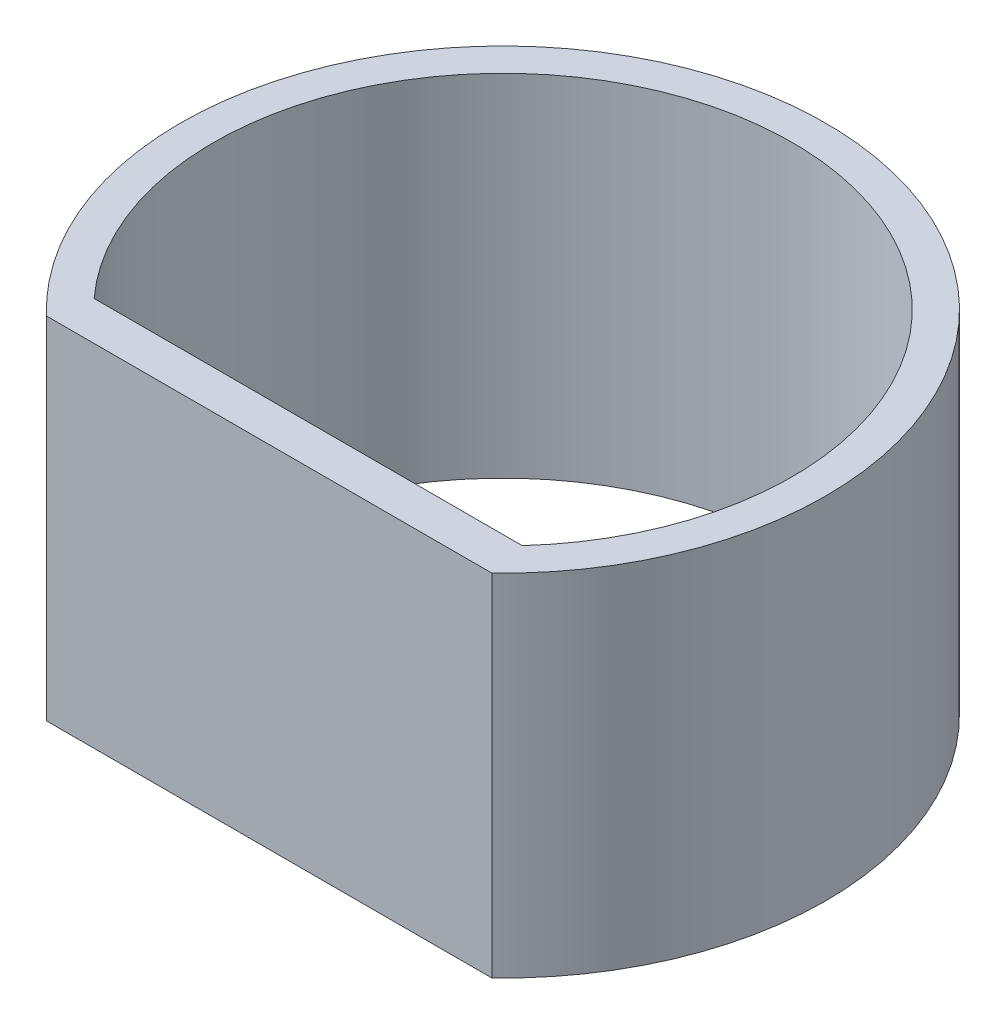
ISO-10303-21;
HEADER;
FILE_DESCRIPTION(('STEP AP214'),'2;1');
FILE_NAME('part.step','',(''),(''),'','','');
FILE_SCHEMA(('AUTOMOTIVE_DESIGN { 1 0 10303 214 1 1 1 1 }'));
ENDSEC;
DATA;
#1=APPLICATION_CONTEXT('core data for automotive mechanical design processes');
#2=APPLICATION_PROTOCOL_DEFINITION('international standard','automotive_design',2000,#1);
#3=PRODUCT_CONTEXT('',#1,'mechanical');
#4=PRODUCT('Part','Part','',(#3));
#5=PRODUCT_RELATED_PRODUCT_CATEGORY('part','',(#4));
#6=PRODUCT_DEFINITION_FORMATION('','',#4);
#7=PRODUCT_DEFINITION_CONTEXT('part definition',#1,'design');
#8=PRODUCT_DEFINITION('design','',#6,#7);
#9=PRODUCT_DEFINITION_SHAPE('','',#8);
#10=(LENGTH_UNIT() NAMED_UNIT(*) SI_UNIT(.MILLI.,.METRE.));
#11=(NAMED_UNIT(*) PLANE_ANGLE_UNIT() SI_UNIT($,.RADIAN.));
#12=(NAMED_UNIT(*) SI_UNIT($,.STERADIAN.) SOLID_ANGLE_UNIT());
#13=UNCERTAINTY_MEASURE_WITH_UNIT(LENGTH_MEASURE(1.E-05),#10,'distance_accuracy_value','');
#14=(GEOMETRIC_REPRESENTATION_CONTEXT(3) GLOBAL_UNCERTAINTY_ASSIGNED_CONTEXT((#13)) GLOBAL_UNIT_ASSIGNED_CONTEXT((#10,
#11,#12)) REPRESENTATION_CONTEXT('',''));
#15=CARTESIAN_POINT('',(0.,0.,0.));
#16=DIRECTION('',(0.,0.,1.));
#17=DIRECTION('',(1.,0.,0.));
#18=AXIS2_PLACEMENT_3D('',#15,#16,#17);
#19=CARTESIAN_POINT('',(0.,6.3,0.));
#20=DIRECTION('',(0.,-1.,0.));
#21=DIRECTION('',(0.,0.,-1.));
#22=AXIS2_PLACEMENT_3D('',#19,#20,#21);
#23=PLANE('',#22);
#24=CARTESIAN_POINT('',(0.,6.3,0.));
#25=DIRECTION('',(0.,1.,0.));
#26=DIRECTION('',(0.,0.,-1.));
#27=AXIS2_PLACEMENT_3D('',#24,#25,#26);
#28=CIRCLE('',#27,5.8);
#29=CARTESIAN_POINT('',(4.,6.3,4.2));
#30=VERTEX_POINT('',#29);
#31=CARTESIAN_POINT('',(-4.,6.3,4.2));
#32=VERTEX_POINT('',#31);
#33=EDGE_CURVE('E90',#30,#32,#28,.T.);
#34=ORIENTED_EDGE('',*,*,#33,.T.);
#35=DIRECTION('',(1.,0.,0.));
#36=VECTOR('',#35,1.);
#37=CARTESIAN_POINT('',(4.,6.3,4.2));
#38=LINE('',#37,#36);
#39=EDGE_CURVE('E93',#32,#30,#38,.T.);
#40=ORIENTED_EDGE('',*,*,#39,.T.);
#41=EDGE_LOOP('',(#34,#40));
#42=FACE_BOUND('',#41,.T.);
#43=CARTESIAN_POINT('',(0.,6.3,0.));
#44=DIRECTION('',(0.,1.,0.));
#45=DIRECTION('',(0.,0.,-1.));
#46=AXIS2_PLACEMENT_3D('',#43,#44,#45);
#47=CIRCLE('',#46,5.2);
#48=CARTESIAN_POINT('',(3.84577690460588,6.3,3.5));
#49=VERTEX_POINT('',#48);
#50=CARTESIAN_POINT('',(-3.84577690460588,6.3,3.5));
#51=VERTEX_POINT('',#50);
#52=EDGE_CURVE('E79',#49,#51,#47,.T.);
#53=ORIENTED_EDGE('',*,*,#52,.F.);
#54=DIRECTION('',(1.,0.,0.));
#55=VECTOR('',#54,1.);
#56=CARTESIAN_POINT('',(-3.84577690460588,6.3,3.5));
#57=LINE('',#56,#55);
#58=EDGE_CURVE('E73',#51,#49,#57,.T.);
#59=ORIENTED_EDGE('',*,*,#58,.F.);
#60=EDGE_LOOP('',(#53,#59));
#61=FACE_BOUND('',#60,.T.);
#62=ADVANCED_FACE('F33',(#42,#61),#23,.F.);
#63=CARTESIAN_POINT('',(0.,0.,0.));
#64=DIRECTION('',(0.,-1.,0.));
#65=DIRECTION('',(0.,0.,-1.));
#66=AXIS2_PLACEMENT_3D('',#63,#64,#65);
#67=PLANE('',#66);
#68=CARTESIAN_POINT('',(0.,0.,0.));
#69=DIRECTION('',(0.,1.,0.));
#70=DIRECTION('',(0.,0.,-1.));
#71=AXIS2_PLACEMENT_3D('',#68,#69,#70);
#72=CIRCLE('',#71,5.8);
#73=CARTESIAN_POINT('',(4.,0.,4.2));
#74=VERTEX_POINT('',#73);
#75=CARTESIAN_POINT('',(-4.,0.,4.2));
#76=VERTEX_POINT('',#75);
#77=EDGE_CURVE('E89',#74,#76,#72,.T.);
#78=ORIENTED_EDGE('',*,*,#77,.F.);
#79=DIRECTION('',(1.,0.,0.));
#80=VECTOR('',#79,1.);
#81=CARTESIAN_POINT('',(4.,0.,4.2));
#82=LINE('',#81,#80);
#83=EDGE_CURVE('E94',#76,#74,#82,.T.);
#84=ORIENTED_EDGE('',*,*,#83,.F.);
#85=EDGE_LOOP('',(#78,#84));
#86=FACE_BOUND('',#85,.T.);
#87=DIRECTION('',(1.,0.,0.));
#88=VECTOR('',#87,1.);
#89=CARTESIAN_POINT('',(-3.84577690460588,0.,3.5));
#90=LINE('',#89,#88);
#91=CARTESIAN_POINT('',(-3.84577690460588,0.,3.5));
#92=VERTEX_POINT('',#91);
#93=CARTESIAN_POINT('',(3.84577690460588,0.,3.5));
#94=VERTEX_POINT('',#93);
#95=EDGE_CURVE('E83',#92,#94,#90,.T.);
#96=ORIENTED_EDGE('',*,*,#95,.T.);
#97=CARTESIAN_POINT('',(0.,0.,0.));
#98=DIRECTION('',(0.,1.,0.));
#99=DIRECTION('',(0.,0.,-1.));
#100=AXIS2_PLACEMENT_3D('',#97,#98,#99);
#101=CIRCLE('',#100,5.2);
#102=EDGE_CURVE('E55',#94,#92,#101,.T.);
#103=ORIENTED_EDGE('',*,*,#102,.T.);
#104=EDGE_LOOP('',(#96,#103));
#105=FACE_BOUND('',#104,.T.);
#106=ADVANCED_FACE('F106',(#86,#105),#67,.T.);
#107=CARTESIAN_POINT('',(0.,6.3,0.));
#108=DIRECTION('',(0.,-1.,0.));
#109=DIRECTION('',(0.,0.,-1.));
#110=AXIS2_PLACEMENT_3D('',#107,#108,#109);
#111=CYLINDRICAL_SURFACE('',#110,5.8);
#112=ORIENTED_EDGE('',*,*,#77,.T.);
#113=DIRECTION('',(0.,-1.,0.));
#114=VECTOR('',#113,1.);
#115=CARTESIAN_POINT('',(-4.,6.3,4.2));
#116=LINE('',#115,#114);
#117=EDGE_CURVE('E11',#32,#76,#116,.T.);
#118=ORIENTED_EDGE('',*,*,#117,.F.);
#119=ORIENTED_EDGE('',*,*,#33,.F.);
#120=DIRECTION('',(0.,-1.,0.));
#121=VECTOR('',#120,1.);
#122=CARTESIAN_POINT('',(4.,6.3,4.2));
#123=LINE('',#122,#121);
#124=EDGE_CURVE('E41',#30,#74,#123,.T.);
#125=ORIENTED_EDGE('',*,*,#124,.T.);
#126=EDGE_LOOP('',(#112,#118,#119,#125));
#127=FACE_BOUND('',#126,.T.);
#128=ADVANCED_FACE('F35',(#127),#111,.T.);
#129=CARTESIAN_POINT('',(4.,6.3,4.2));
#130=DIRECTION('',(0.,0.,-1.));
#131=DIRECTION('',(-1.,0.,0.));
#132=AXIS2_PLACEMENT_3D('',#129,#130,#131);
#133=PLANE('',#132);
#134=ORIENTED_EDGE('',*,*,#83,.T.);
#135=ORIENTED_EDGE('',*,*,#124,.F.);
#136=ORIENTED_EDGE('',*,*,#39,.F.);
#137=ORIENTED_EDGE('',*,*,#117,.T.);
#138=EDGE_LOOP('',(#134,#135,#136,#137));
#139=FACE_BOUND('',#138,.T.);
#140=ADVANCED_FACE('F108',(#139),#133,.F.);
#141=CARTESIAN_POINT('',(0.,6.3,0.));
#142=DIRECTION('',(0.,-1.,0.));
#143=DIRECTION('',(0.,0.,-1.));
#144=AXIS2_PLACEMENT_3D('',#141,#142,#143);
#145=CYLINDRICAL_SURFACE('',#144,5.2);
#146=ORIENTED_EDGE('',*,*,#102,.F.);
#147=DIRECTION('',(0.,-1.,0.));
#148=VECTOR('',#147,1.);
#149=CARTESIAN_POINT('',(3.84577690460588,6.3,3.5));
#150=LINE('',#149,#148);
#151=EDGE_CURVE('E75',#49,#94,#150,.T.);
#152=ORIENTED_EDGE('',*,*,#151,.F.);
#153=ORIENTED_EDGE('',*,*,#52,.T.);
#154=DIRECTION('',(0.,-1.,0.));
#155=VECTOR('',#154,1.);
#156=CARTESIAN_POINT('',(-3.84577690460588,6.3,3.5));
#157=LINE('',#156,#155);
#158=EDGE_CURVE('E48',#51,#92,#157,.T.);
#159=ORIENTED_EDGE('',*,*,#158,.T.);
#160=EDGE_LOOP('',(#146,#152,#153,#159));
#161=FACE_BOUND('',#160,.T.);
#162=ADVANCED_FACE('F81',(#161),#145,.F.);
#163=CARTESIAN_POINT('',(-3.84577690460588,6.3,3.5));
#164=DIRECTION('',(0.,0.,-1.));
#165=DIRECTION('',(-1.,0.,0.));
#166=AXIS2_PLACEMENT_3D('',#163,#164,#165);
#167=PLANE('',#166);
#168=ORIENTED_EDGE('',*,*,#95,.F.);
#169=ORIENTED_EDGE('',*,*,#158,.F.);
#170=ORIENTED_EDGE('',*,*,#58,.T.);
#171=ORIENTED_EDGE('',*,*,#151,.T.);
#172=EDGE_LOOP('',(#168,#169,#170,#171));
#173=FACE_BOUND('',#172,.T.);
#174=ADVANCED_FACE('F74',(#173),#167,.T.);
#175=CLOSED_SHELL('',(#62,#106,#128,#140,#162,#174));
#176=MANIFOLD_SOLID_BREP('B2',#175);
#177=ADVANCED_BREP_SHAPE_REPRESENTATION('',(#18,#176),#14);
#178=SHAPE_DEFINITION_REPRESENTATION(#9,#177);
ENDSEC;
END-ISO-10303-21;
